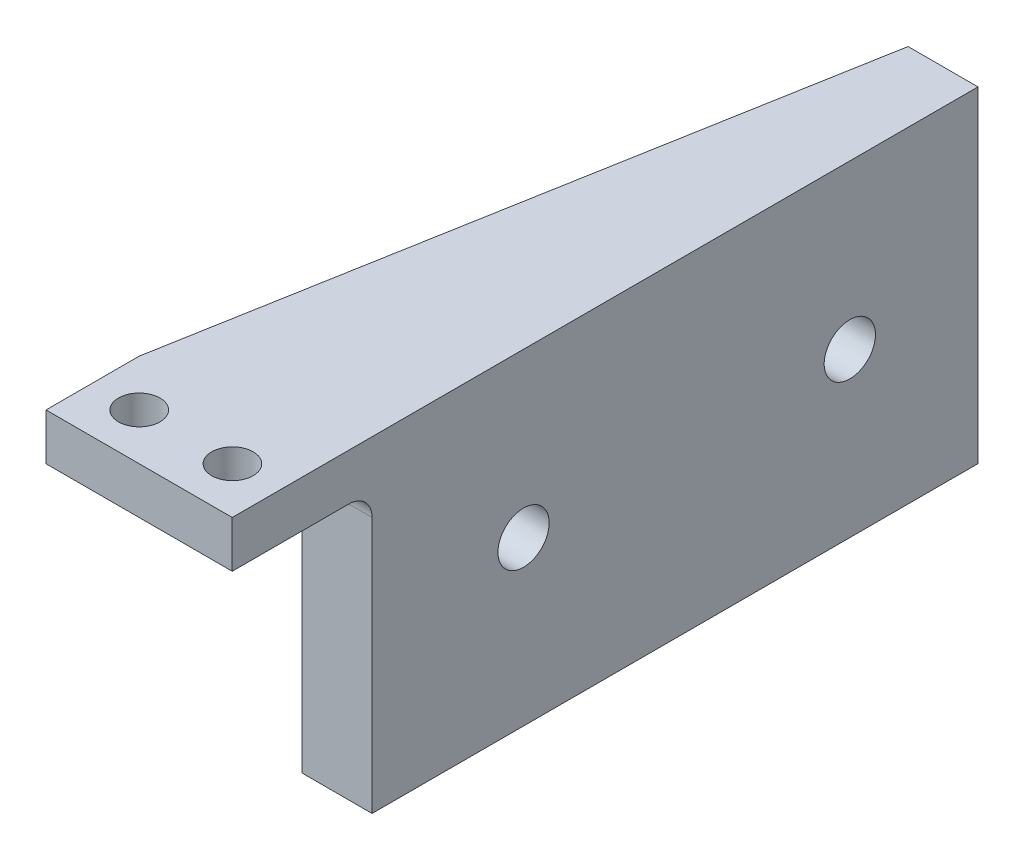
ISO-10303-21;
HEADER;
FILE_DESCRIPTION(('STEP AP214'),'2;1');
FILE_NAME('part.step','',(''),(''),'','','');
FILE_SCHEMA(('AUTOMOTIVE_DESIGN { 1 0 10303 214 1 1 1 1 }'));
ENDSEC;
DATA;
#1=APPLICATION_CONTEXT('core data for automotive mechanical design processes');
#2=APPLICATION_PROTOCOL_DEFINITION('international standard','automotive_design',2000,#1);
#3=PRODUCT_CONTEXT('',#1,'mechanical');
#4=PRODUCT('Part','Part','',(#3));
#5=PRODUCT_RELATED_PRODUCT_CATEGORY('part','',(#4));
#6=PRODUCT_DEFINITION_FORMATION('','',#4);
#7=PRODUCT_DEFINITION_CONTEXT('part definition',#1,'design');
#8=PRODUCT_DEFINITION('design','',#6,#7);
#9=PRODUCT_DEFINITION_SHAPE('','',#8);
#10=(LENGTH_UNIT() NAMED_UNIT(*) SI_UNIT(.MILLI.,.METRE.));
#11=(NAMED_UNIT(*) PLANE_ANGLE_UNIT() SI_UNIT($,.RADIAN.));
#12=(NAMED_UNIT(*) SI_UNIT($,.STERADIAN.) SOLID_ANGLE_UNIT());
#13=UNCERTAINTY_MEASURE_WITH_UNIT(LENGTH_MEASURE(1.E-05),#10,'distance_accuracy_value','');
#14=(GEOMETRIC_REPRESENTATION_CONTEXT(3) GLOBAL_UNCERTAINTY_ASSIGNED_CONTEXT((#13)) GLOBAL_UNIT_ASSIGNED_CONTEXT((#10,
#11,#12)) REPRESENTATION_CONTEXT('',''));
#15=CARTESIAN_POINT('',(0.,0.,0.));
#16=DIRECTION('',(0.,0.,1.));
#17=DIRECTION('',(1.,0.,0.));
#18=AXIS2_PLACEMENT_3D('',#15,#16,#17);
#19=CARTESIAN_POINT('',(0.,2.54,0.));
#20=DIRECTION('',(0.,-1.,0.));
#21=DIRECTION('',(0.,0.,-1.));
#22=AXIS2_PLACEMENT_3D('',#19,#20,#21);
#23=PLANE('',#22);
#24=DIRECTION('',(-1.,0.,0.));
#25=VECTOR('',#24,1.);
#26=CARTESIAN_POINT('',(3.79857,2.54,-38.1));
#27=LINE('',#26,#25);
#28=CARTESIAN_POINT('',(7.60857,2.54,-38.1));
#29=VERTEX_POINT('',#28);
#30=CARTESIAN_POINT('',(3.79857,2.54,-38.1));
#31=VERTEX_POINT('',#30);
#32=EDGE_CURVE('E157',#29,#31,#27,.T.);
#33=ORIENTED_EDGE('',*,*,#32,.T.);
#34=DIRECTION('',(-0.175483967980495,0.,0.984482288810632));
#35=VECTOR('',#34,1.);
#36=CARTESIAN_POINT('',(-2.54,2.54,-2.54));
#37=LINE('',#36,#35);
#38=CARTESIAN_POINT('',(-2.54,2.54,-2.54));
#39=VERTEX_POINT('',#38);
#40=EDGE_CURVE('E160',#31,#39,#37,.T.);
#41=ORIENTED_EDGE('',*,*,#40,.T.);
#42=DIRECTION('',(0.,0.,1.));
#43=VECTOR('',#42,1.);
#44=CARTESIAN_POINT('',(-2.54,2.54,2.54));
#45=LINE('',#44,#43);
#46=CARTESIAN_POINT('',(-2.54,2.54,2.54));
#47=VERTEX_POINT('',#46);
#48=EDGE_CURVE('E163',#39,#47,#45,.T.);
#49=ORIENTED_EDGE('',*,*,#48,.T.);
#50=DIRECTION('',(1.,0.,0.));
#51=VECTOR('',#50,1.);
#52=CARTESIAN_POINT('',(-2.54,2.54,2.54));
#53=LINE('',#52,#51);
#54=CARTESIAN_POINT('',(7.60857,2.54,2.54));
#55=VERTEX_POINT('',#54);
#56=EDGE_CURVE('E165',#47,#55,#53,.T.);
#57=ORIENTED_EDGE('',*,*,#56,.T.);
#58=DIRECTION('',(0.,0.,-1.));
#59=VECTOR('',#58,1.);
#60=CARTESIAN_POINT('',(7.60857,2.54,2.54));
#61=LINE('',#60,#59);
#62=EDGE_CURVE('E167',#55,#29,#61,.T.);
#63=ORIENTED_EDGE('',*,*,#62,.T.);
#64=EDGE_LOOP('',(#33,#41,#49,#57,#63));
#65=FACE_BOUND('',#64,.T.);
#66=CARTESIAN_POINT('',(0.,2.54,0.));
#67=DIRECTION('',(0.,1.,0.));
#68=DIRECTION('',(0.,0.,1.));
#69=AXIS2_PLACEMENT_3D('',#66,#67,#68);
#70=CIRCLE('',#69,1.1303);
#71=CARTESIAN_POINT('',(0.,2.54,1.1303));
#72=VERTEX_POINT('',#71);
#73=EDGE_CURVE('E151',#72,#72,#70,.T.);
#74=ORIENTED_EDGE('',*,*,#73,.F.);
#75=EDGE_LOOP('',(#74));
#76=FACE_BOUND('',#75,.T.);
#77=CARTESIAN_POINT('',(5.08,2.54,0.));
#78=DIRECTION('',(0.,1.,0.));
#79=DIRECTION('',(0.,0.,1.));
#80=AXIS2_PLACEMENT_3D('',#77,#78,#79);
#81=CIRCLE('',#80,1.1303);
#82=CARTESIAN_POINT('',(5.08,2.54,1.1303));
#83=VERTEX_POINT('',#82);
#84=EDGE_CURVE('E142',#83,#83,#81,.T.);
#85=ORIENTED_EDGE('',*,*,#84,.F.);
#86=EDGE_LOOP('',(#85));
#87=FACE_BOUND('',#86,.T.);
#88=ADVANCED_FACE('F40',(#65,#76,#87),#23,.F.);
#89=CARTESIAN_POINT('',(0.,0.,0.));
#90=DIRECTION('',(0.,-1.,0.));
#91=DIRECTION('',(0.,0.,-1.));
#92=AXIS2_PLACEMENT_3D('',#89,#90,#91);
#93=PLANE('',#92);
#94=DIRECTION('',(0.,0.,-1.));
#95=VECTOR('',#94,1.);
#96=CARTESIAN_POINT('',(2.52857,0.,0.));
#97=LINE('',#96,#95);
#98=CARTESIAN_POINT('',(2.52857,0.,-30.975175315568));
#99=VERTEX_POINT('',#98);
#100=CARTESIAN_POINT('',(2.52857,0.,-3.81));
#101=VERTEX_POINT('',#100);
#102=EDGE_CURVE('E64',#99,#101,#97,.F.);
#103=ORIENTED_EDGE('',*,*,#102,.T.);
#104=DIRECTION('',(-1.,0.,0.));
#105=VECTOR('',#104,1.);
#106=CARTESIAN_POINT('',(0.,0.,-3.81));
#107=LINE('',#106,#105);
#108=CARTESIAN_POINT('',(7.60857,0.,-3.81000000000001));
#109=VERTEX_POINT('',#108);
#110=EDGE_CURVE('E191',#101,#109,#107,.F.);
#111=ORIENTED_EDGE('',*,*,#110,.T.);
#112=DIRECTION('',(0.,0.,-1.));
#113=VECTOR('',#112,1.);
#114=CARTESIAN_POINT('',(7.60857,0.,-38.1));
#115=LINE('',#114,#113);
#116=CARTESIAN_POINT('',(7.60857,0.,2.54));
#117=VERTEX_POINT('',#116);
#118=EDGE_CURVE('E161',#117,#109,#115,.T.);
#119=ORIENTED_EDGE('',*,*,#118,.F.);
#120=DIRECTION('',(1.,0.,0.));
#121=VECTOR('',#120,1.);
#122=CARTESIAN_POINT('',(-2.54,0.,2.54));
#123=LINE('',#122,#121);
#124=CARTESIAN_POINT('',(-2.54,0.,2.54));
#125=VERTEX_POINT('',#124);
#126=EDGE_CURVE('E173',#125,#117,#123,.T.);
#127=ORIENTED_EDGE('',*,*,#126,.F.);
#128=DIRECTION('',(0.,0.,1.));
#129=VECTOR('',#128,1.);
#130=CARTESIAN_POINT('',(-2.54,0.,2.54));
#131=LINE('',#130,#129);
#132=CARTESIAN_POINT('',(-2.54,0.,-2.54));
#133=VERTEX_POINT('',#132);
#134=EDGE_CURVE('E171',#133,#125,#131,.T.);
#135=ORIENTED_EDGE('',*,*,#134,.F.);
#136=DIRECTION('',(-0.175483967980495,0.,0.984482288810632));
#137=VECTOR('',#136,1.);
#138=CARTESIAN_POINT('',(-2.54,0.,-2.54));
#139=LINE('',#138,#137);
#140=EDGE_CURVE('E154',#99,#133,#139,.T.);
#141=ORIENTED_EDGE('',*,*,#140,.F.);
#142=EDGE_LOOP('',(#103,#111,#119,#127,#135,#141));
#143=FACE_BOUND('',#142,.T.);
#144=CARTESIAN_POINT('',(0.,0.,0.));
#145=DIRECTION('',(0.,1.,0.));
#146=DIRECTION('',(0.,0.,1.));
#147=AXIS2_PLACEMENT_3D('',#144,#145,#146);
#148=CIRCLE('',#147,1.1303);
#149=CARTESIAN_POINT('',(0.,0.,1.1303));
#150=VERTEX_POINT('',#149);
#151=EDGE_CURVE('E149',#150,#150,#148,.T.);
#152=ORIENTED_EDGE('',*,*,#151,.T.);
#153=EDGE_LOOP('',(#152));
#154=FACE_BOUND('',#153,.T.);
#155=CARTESIAN_POINT('',(5.08,0.,0.));
#156=DIRECTION('',(0.,1.,0.));
#157=DIRECTION('',(0.,0.,1.));
#158=AXIS2_PLACEMENT_3D('',#155,#156,#157);
#159=CIRCLE('',#158,1.1303);
#160=CARTESIAN_POINT('',(5.08,0.,1.1303));
#161=VERTEX_POINT('',#160);
#162=EDGE_CURVE('E139',#161,#161,#159,.T.);
#163=ORIENTED_EDGE('',*,*,#162,.T.);
#164=EDGE_LOOP('',(#163));
#165=FACE_BOUND('',#164,.T.);
#166=ADVANCED_FACE('F224',(#143,#154,#165),#93,.T.);
#167=CARTESIAN_POINT('',(3.79857,2.54,-38.1));
#168=DIRECTION('',(0.,0.,1.));
#169=DIRECTION('',(1.,0.,0.));
#170=AXIS2_PLACEMENT_3D('',#167,#168,#169);
#171=PLANE('',#170);
#172=DIRECTION('',(0.,-1.,0.));
#173=VECTOR('',#172,1.);
#174=CARTESIAN_POINT('',(7.60857,2.54,-38.1));
#175=LINE('',#174,#173);
#176=CARTESIAN_POINT('',(7.60857,-15.24,-38.1));
#177=VERTEX_POINT('',#176);
#178=EDGE_CURVE('E169',#29,#177,#175,.T.);
#179=ORIENTED_EDGE('',*,*,#178,.T.);
#180=DIRECTION('',(1.,0.,0.));
#181=VECTOR('',#180,1.);
#182=CARTESIAN_POINT('',(7.60857,-15.24,-38.1));
#183=LINE('',#182,#181);
#184=CARTESIAN_POINT('',(3.79857,-15.24,-38.1));
#185=VERTEX_POINT('',#184);
#186=EDGE_CURVE('E131',#185,#177,#183,.T.);
#187=ORIENTED_EDGE('',*,*,#186,.F.);
#188=DIRECTION('',(0.,1.,0.));
#189=VECTOR('',#188,1.);
#190=CARTESIAN_POINT('',(3.79857,-15.24,-38.1));
#191=LINE('',#190,#189);
#192=CARTESIAN_POINT('',(3.79857,-1.27,-38.1));
#193=VERTEX_POINT('',#192);
#194=EDGE_CURVE('E144',#185,#193,#191,.T.);
#195=ORIENTED_EDGE('',*,*,#194,.T.);
#196=DIRECTION('',(0.,-1.,0.));
#197=VECTOR('',#196,1.);
#198=CARTESIAN_POINT('',(3.79857,2.54,-38.1));
#199=LINE('',#198,#197);
#200=EDGE_CURVE('E56',#31,#193,#199,.T.);
#201=ORIENTED_EDGE('',*,*,#200,.F.);
#202=ORIENTED_EDGE('',*,*,#32,.F.);
#203=EDGE_LOOP('',(#179,#187,#195,#201,#202));
#204=FACE_BOUND('',#203,.T.);
#205=ADVANCED_FACE('F215',(#204),#171,.F.);
#206=CARTESIAN_POINT('',(-2.54,2.54,-2.54));
#207=DIRECTION('',(0.984482288810632,0.,0.175483967980495));
#208=DIRECTION('',(0.175483967980495,0.,-0.984482288810632));
#209=AXIS2_PLACEMENT_3D('',#206,#207,#208);
#210=PLANE('',#209);
#211=ORIENTED_EDGE('',*,*,#200,.T.);
#212=CARTESIAN_POINT('',(2.52857,-1.27,-30.975175315568));
#213=DIRECTION('',(0.984482288810632,0.,0.175483967980495));
#214=DIRECTION('',(0.175483967980495,0.,-0.984482288810632));
#215=AXIS2_PLACEMENT_3D('',#212,#213,#214);
#216=ELLIPSE('',#215,7.23712835203931,1.27);
#217=EDGE_CURVE('E11',#193,#99,#216,.T.);
#218=ORIENTED_EDGE('',*,*,#217,.T.);
#219=ORIENTED_EDGE('',*,*,#140,.T.);
#220=DIRECTION('',(0.,-1.,0.));
#221=VECTOR('',#220,1.);
#222=CARTESIAN_POINT('',(-2.54,2.54,-2.54));
#223=LINE('',#222,#221);
#224=EDGE_CURVE('E184',#39,#133,#223,.T.);
#225=ORIENTED_EDGE('',*,*,#224,.F.);
#226=ORIENTED_EDGE('',*,*,#40,.F.);
#227=EDGE_LOOP('',(#211,#218,#219,#225,#226));
#228=FACE_BOUND('',#227,.T.);
#229=ADVANCED_FACE('F221',(#228),#210,.F.);
#230=CARTESIAN_POINT('',(-2.54,2.54,2.54));
#231=DIRECTION('',(1.,0.,0.));
#232=DIRECTION('',(0.,0.,-1.));
#233=AXIS2_PLACEMENT_3D('',#230,#231,#232);
#234=PLANE('',#233);
#235=ORIENTED_EDGE('',*,*,#134,.T.);
#236=DIRECTION('',(0.,-1.,0.));
#237=VECTOR('',#236,1.);
#238=CARTESIAN_POINT('',(-2.54,2.54,2.54));
#239=LINE('',#238,#237);
#240=EDGE_CURVE('E181',#47,#125,#239,.T.);
#241=ORIENTED_EDGE('',*,*,#240,.F.);
#242=ORIENTED_EDGE('',*,*,#48,.F.);
#243=ORIENTED_EDGE('',*,*,#224,.T.);
#244=EDGE_LOOP('',(#235,#241,#242,#243));
#245=FACE_BOUND('',#244,.T.);
#246=ADVANCED_FACE('F229',(#245),#234,.F.);
#247=CARTESIAN_POINT('',(-2.54,2.54,2.54));
#248=DIRECTION('',(0.,0.,-1.));
#249=DIRECTION('',(-1.,0.,0.));
#250=AXIS2_PLACEMENT_3D('',#247,#248,#249);
#251=PLANE('',#250);
#252=ORIENTED_EDGE('',*,*,#126,.T.);
#253=DIRECTION('',(0.,-1.,0.));
#254=VECTOR('',#253,1.);
#255=CARTESIAN_POINT('',(7.60857,2.54,2.54));
#256=LINE('',#255,#254);
#257=EDGE_CURVE('E178',#55,#117,#256,.T.);
#258=ORIENTED_EDGE('',*,*,#257,.F.);
#259=ORIENTED_EDGE('',*,*,#56,.F.);
#260=ORIENTED_EDGE('',*,*,#240,.T.);
#261=EDGE_LOOP('',(#252,#258,#259,#260));
#262=FACE_BOUND('',#261,.T.);
#263=ADVANCED_FACE('F233',(#262),#251,.F.);
#264=CARTESIAN_POINT('',(7.60857,2.54,-38.1));
#265=DIRECTION('',(-1.,0.,0.));
#266=DIRECTION('',(0.,0.,1.));
#267=AXIS2_PLACEMENT_3D('',#264,#265,#266);
#268=PLANE('',#267);
#269=CARTESIAN_POINT('',(7.60857,-6.35,-13.335254));
#270=DIRECTION('',(1.,0.,0.));
#271=DIRECTION('',(0.,0.,-1.));
#272=AXIS2_PLACEMENT_3D('',#269,#270,#271);
#273=CIRCLE('',#272,1.397);
#274=CARTESIAN_POINT('',(7.60857,-6.35,-14.732254));
#275=VERTEX_POINT('',#274);
#276=EDGE_CURVE('E198',#275,#275,#273,.T.);
#277=ORIENTED_EDGE('',*,*,#276,.F.);
#278=EDGE_LOOP('',(#277));
#279=FACE_BOUND('',#278,.T.);
#280=CARTESIAN_POINT('',(7.60857,-6.35,-31.115254));
#281=DIRECTION('',(1.,0.,0.));
#282=DIRECTION('',(0.,0.,-1.));
#283=AXIS2_PLACEMENT_3D('',#280,#281,#282);
#284=CIRCLE('',#283,1.39700000000001);
#285=CARTESIAN_POINT('',(7.60857,-6.35,-32.512254));
#286=VERTEX_POINT('',#285);
#287=EDGE_CURVE('E203',#286,#286,#284,.T.);
#288=ORIENTED_EDGE('',*,*,#287,.F.);
#289=EDGE_LOOP('',(#288));
#290=FACE_BOUND('',#289,.T.);
#291=ORIENTED_EDGE('',*,*,#118,.T.);
#292=CARTESIAN_POINT('',(7.60857,-1.27,-3.81));
#293=DIRECTION('',(-1.,0.,0.));
#294=DIRECTION('',(0.,0.,1.));
#295=AXIS2_PLACEMENT_3D('',#292,#293,#294);
#296=CIRCLE('',#295,1.27);
#297=CARTESIAN_POINT('',(7.60857,-1.27,-5.08));
#298=VERTEX_POINT('',#297);
#299=EDGE_CURVE('E49',#109,#298,#296,.T.);
#300=ORIENTED_EDGE('',*,*,#299,.T.);
#301=DIRECTION('',(0.,1.,0.));
#302=VECTOR('',#301,1.);
#303=CARTESIAN_POINT('',(7.60857,-15.24,-5.08));
#304=LINE('',#303,#302);
#305=CARTESIAN_POINT('',(7.60857,-15.24,-5.08));
#306=VERTEX_POINT('',#305);
#307=EDGE_CURVE('E118',#306,#298,#304,.T.);
#308=ORIENTED_EDGE('',*,*,#307,.F.);
#309=DIRECTION('',(0.,0.,1.));
#310=VECTOR('',#309,1.);
#311=CARTESIAN_POINT('',(7.60857,-15.24,-38.1));
#312=LINE('',#311,#310);
#313=EDGE_CURVE('E125',#177,#306,#312,.T.);
#314=ORIENTED_EDGE('',*,*,#313,.F.);
#315=ORIENTED_EDGE('',*,*,#178,.F.);
#316=ORIENTED_EDGE('',*,*,#62,.F.);
#317=ORIENTED_EDGE('',*,*,#257,.T.);
#318=EDGE_LOOP('',(#291,#300,#308,#314,#315,#316,#317));
#319=FACE_BOUND('',#318,.T.);
#320=ADVANCED_FACE('F137',(#279,#290,#319),#268,.F.);
#321=CARTESIAN_POINT('',(0.,2.54,0.));
#322=DIRECTION('',(0.,-1.,0.));
#323=DIRECTION('',(0.,0.,-1.));
#324=AXIS2_PLACEMENT_3D('',#321,#322,#323);
#325=CYLINDRICAL_SURFACE('',#324,1.1303);
#326=ORIENTED_EDGE('',*,*,#73,.T.);
#327=EDGE_LOOP('',(#326));
#328=FACE_BOUND('',#327,.T.);
#329=ORIENTED_EDGE('',*,*,#151,.F.);
#330=EDGE_LOOP('',(#329));
#331=FACE_BOUND('',#330,.T.);
#332=ADVANCED_FACE('F258',(#328,#331),#325,.F.);
#333=CARTESIAN_POINT('',(5.08,2.54,0.));
#334=DIRECTION('',(0.,-1.,0.));
#335=DIRECTION('',(0.,0.,-1.));
#336=AXIS2_PLACEMENT_3D('',#333,#334,#335);
#337=CYLINDRICAL_SURFACE('',#336,1.1303);
#338=ORIENTED_EDGE('',*,*,#84,.T.);
#339=EDGE_LOOP('',(#338));
#340=FACE_BOUND('',#339,.T.);
#341=ORIENTED_EDGE('',*,*,#162,.F.);
#342=EDGE_LOOP('',(#341));
#343=FACE_BOUND('',#342,.T.);
#344=ADVANCED_FACE('F249',(#340,#343),#337,.F.);
#345=CARTESIAN_POINT('',(7.60857,-15.24,-5.08));
#346=DIRECTION('',(0.,0.,-1.));
#347=DIRECTION('',(-1.,0.,0.));
#348=AXIS2_PLACEMENT_3D('',#345,#346,#347);
#349=PLANE('',#348);
#350=ORIENTED_EDGE('',*,*,#307,.T.);
#351=DIRECTION('',(-1.,0.,0.));
#352=VECTOR('',#351,1.);
#353=CARTESIAN_POINT('',(7.60857,-1.27,-5.08));
#354=LINE('',#353,#352);
#355=CARTESIAN_POINT('',(3.79857,-1.27,-5.08));
#356=VERTEX_POINT('',#355);
#357=EDGE_CURVE('E188',#298,#356,#354,.T.);
#358=ORIENTED_EDGE('',*,*,#357,.T.);
#359=DIRECTION('',(0.,1.,0.));
#360=VECTOR('',#359,1.);
#361=CARTESIAN_POINT('',(3.79857,-15.24,-5.08));
#362=LINE('',#361,#360);
#363=CARTESIAN_POINT('',(3.79857,-15.24,-5.08));
#364=VERTEX_POINT('',#363);
#365=EDGE_CURVE('E121',#364,#356,#362,.T.);
#366=ORIENTED_EDGE('',*,*,#365,.F.);
#367=DIRECTION('',(-1.,0.,0.));
#368=VECTOR('',#367,1.);
#369=CARTESIAN_POINT('',(7.60857,-15.24,-5.08));
#370=LINE('',#369,#368);
#371=EDGE_CURVE('E113',#306,#364,#370,.T.);
#372=ORIENTED_EDGE('',*,*,#371,.F.);
#373=EDGE_LOOP('',(#350,#358,#366,#372));
#374=FACE_BOUND('',#373,.T.);
#375=ADVANCED_FACE('F115',(#374),#349,.F.);
#376=CARTESIAN_POINT('',(3.79857,-15.24,-38.1));
#377=DIRECTION('',(1.,0.,0.));
#378=DIRECTION('',(0.,0.,-1.));
#379=AXIS2_PLACEMENT_3D('',#376,#377,#378);
#380=PLANE('',#379);
#381=CARTESIAN_POINT('',(3.79857,-6.35,-13.335254));
#382=DIRECTION('',(1.,0.,0.));
#383=DIRECTION('',(0.,0.,-1.));
#384=AXIS2_PLACEMENT_3D('',#381,#382,#383);
#385=CIRCLE('',#384,1.397);
#386=CARTESIAN_POINT('',(3.79857,-6.35,-14.732254));
#387=VERTEX_POINT('',#386);
#388=EDGE_CURVE('E44',#387,#387,#385,.T.);
#389=ORIENTED_EDGE('',*,*,#388,.T.);
#390=EDGE_LOOP('',(#389));
#391=FACE_BOUND('',#390,.T.);
#392=CARTESIAN_POINT('',(3.79857,-6.35,-31.115254));
#393=DIRECTION('',(1.,0.,0.));
#394=DIRECTION('',(0.,0.,-1.));
#395=AXIS2_PLACEMENT_3D('',#392,#393,#394);
#396=CIRCLE('',#395,1.39700000000001);
#397=CARTESIAN_POINT('',(3.79857,-6.35,-32.512254));
#398=VERTEX_POINT('',#397);
#399=EDGE_CURVE('E196',#398,#398,#396,.T.);
#400=ORIENTED_EDGE('',*,*,#399,.T.);
#401=EDGE_LOOP('',(#400));
#402=FACE_BOUND('',#401,.T.);
#403=ORIENTED_EDGE('',*,*,#365,.T.);
#404=DIRECTION('',(0.,0.,-1.));
#405=VECTOR('',#404,1.);
#406=CARTESIAN_POINT('',(3.79857,-1.27,-38.1));
#407=LINE('',#406,#405);
#408=EDGE_CURVE('E193',#356,#193,#407,.T.);
#409=ORIENTED_EDGE('',*,*,#408,.T.);
#410=ORIENTED_EDGE('',*,*,#194,.F.);
#411=DIRECTION('',(0.,0.,-1.));
#412=VECTOR('',#411,1.);
#413=CARTESIAN_POINT('',(3.79857,-15.24,-38.1));
#414=LINE('',#413,#412);
#415=EDGE_CURVE('E124',#364,#185,#414,.T.);
#416=ORIENTED_EDGE('',*,*,#415,.F.);
#417=EDGE_LOOP('',(#403,#409,#410,#416));
#418=FACE_BOUND('',#417,.T.);
#419=ADVANCED_FACE('F240',(#391,#402,#418),#380,.F.);
#420=CARTESIAN_POINT('',(0.,-15.24,0.));
#421=DIRECTION('',(0.,-1.,0.));
#422=DIRECTION('',(0.,0.,-1.));
#423=AXIS2_PLACEMENT_3D('',#420,#421,#422);
#424=PLANE('',#423);
#425=ORIENTED_EDGE('',*,*,#313,.T.);
#426=ORIENTED_EDGE('',*,*,#371,.T.);
#427=ORIENTED_EDGE('',*,*,#415,.T.);
#428=ORIENTED_EDGE('',*,*,#186,.T.);
#429=EDGE_LOOP('',(#425,#426,#427,#428));
#430=FACE_BOUND('',#429,.T.);
#431=ADVANCED_FACE('F129',(#430),#424,.T.);
#432=CARTESIAN_POINT('',(2.52857,-1.27,-38.1));
#433=DIRECTION('',(0.,0.,-1.));
#434=DIRECTION('',(-1.,0.,0.));
#435=AXIS2_PLACEMENT_3D('',#432,#433,#434);
#436=CYLINDRICAL_SURFACE('',#435,1.27);
#437=ORIENTED_EDGE('',*,*,#217,.F.);
#438=ORIENTED_EDGE('',*,*,#408,.F.);
#439=CARTESIAN_POINT('',(2.52857,-1.27,-3.81));
#440=DIRECTION('',(-0.707106781186548,0.,-0.707106781186547));
#441=DIRECTION('',(0.707106781186547,0.,-0.707106781186548));
#442=AXIS2_PLACEMENT_3D('',#439,#440,#441);
#443=ELLIPSE('',#442,1.79605122421383,1.27);
#444=EDGE_CURVE('E134',#101,#356,#443,.T.);
#445=ORIENTED_EDGE('',*,*,#444,.F.);
#446=ORIENTED_EDGE('',*,*,#102,.F.);
#447=EDGE_LOOP('',(#437,#438,#445,#446));
#448=FACE_BOUND('',#447,.T.);
#449=ADVANCED_FACE('F42',(#448),#436,.F.);
#450=CARTESIAN_POINT('',(7.60857,-1.27,-3.81));
#451=DIRECTION('',(-1.,0.,0.));
#452=DIRECTION('',(0.,0.,1.));
#453=AXIS2_PLACEMENT_3D('',#450,#451,#452);
#454=CYLINDRICAL_SURFACE('',#453,1.27);
#455=ORIENTED_EDGE('',*,*,#299,.F.);
#456=ORIENTED_EDGE('',*,*,#110,.F.);
#457=ORIENTED_EDGE('',*,*,#444,.T.);
#458=ORIENTED_EDGE('',*,*,#357,.F.);
#459=EDGE_LOOP('',(#455,#456,#457,#458));
#460=FACE_BOUND('',#459,.T.);
#461=ADVANCED_FACE('F239',(#460),#454,.F.);
#462=CARTESIAN_POINT('',(-5.09143,-6.35,-31.115254));
#463=DIRECTION('',(1.,0.,0.));
#464=DIRECTION('',(0.,0.,-1.));
#465=AXIS2_PLACEMENT_3D('',#462,#463,#464);
#466=CYLINDRICAL_SURFACE('',#465,1.39700000000001);
#467=ORIENTED_EDGE('',*,*,#287,.T.);
#468=EDGE_LOOP('',(#467));
#469=FACE_BOUND('',#468,.T.);
#470=ORIENTED_EDGE('',*,*,#399,.F.);
#471=EDGE_LOOP('',(#470));
#472=FACE_BOUND('',#471,.T.);
#473=ADVANCED_FACE('F272',(#469,#472),#466,.F.);
#474=CARTESIAN_POINT('',(-5.09143,-6.35,-13.335254));
#475=DIRECTION('',(1.,0.,0.));
#476=DIRECTION('',(0.,0.,-1.));
#477=AXIS2_PLACEMENT_3D('',#474,#475,#476);
#478=CYLINDRICAL_SURFACE('',#477,1.397);
#479=ORIENTED_EDGE('',*,*,#276,.T.);
#480=EDGE_LOOP('',(#479));
#481=FACE_BOUND('',#480,.T.);
#482=ORIENTED_EDGE('',*,*,#388,.F.);
#483=EDGE_LOOP('',(#482));
#484=FACE_BOUND('',#483,.T.);
#485=ADVANCED_FACE('F277',(#481,#484),#478,.F.);
#486=CLOSED_SHELL('',(#88,#166,#205,#229,#246,#263,#320,#332,#344,#375,#419,#431,#449,#461,#473,#485));
#487=MANIFOLD_SOLID_BREP('B2',#486);
#488=ADVANCED_BREP_SHAPE_REPRESENTATION('',(#18,#487),#14);
#489=SHAPE_DEFINITION_REPRESENTATION(#9,#488);
ENDSEC;
END-ISO-10303-21;
